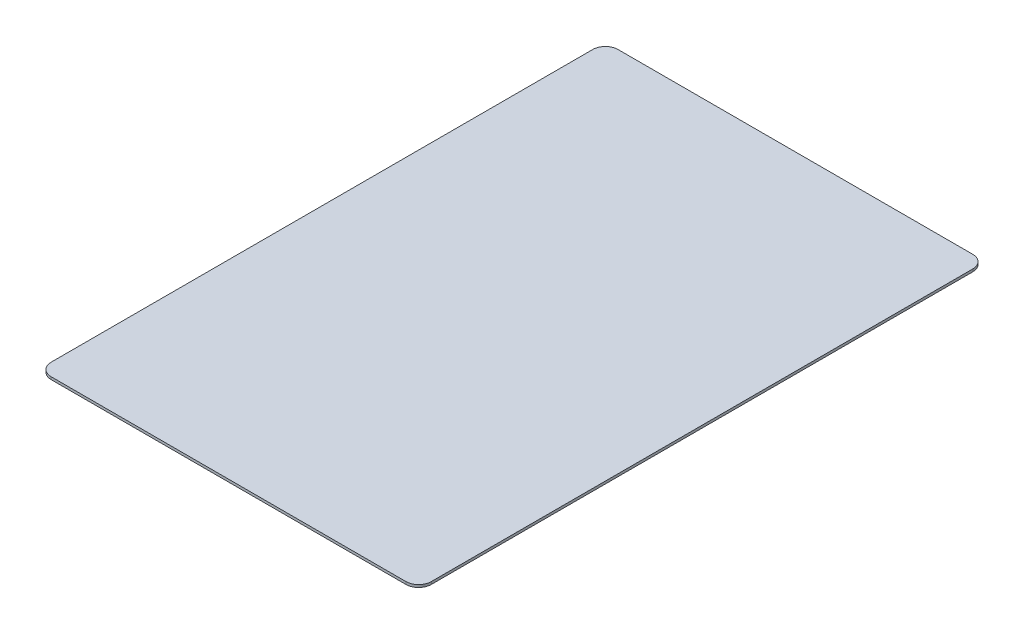
ISO-10303-21;
HEADER;
FILE_DESCRIPTION(('STEP AP214'),'2;1');
FILE_NAME('part.step','',(''),(''),'','','');
FILE_SCHEMA(('AUTOMOTIVE_DESIGN { 1 0 10303 214 1 1 1 1 }'));
ENDSEC;
DATA;
#1=APPLICATION_CONTEXT('core data for automotive mechanical design processes');
#2=APPLICATION_PROTOCOL_DEFINITION('international standard','automotive_design',2000,#1);
#3=PRODUCT_CONTEXT('',#1,'mechanical');
#4=PRODUCT('Part','Part','',(#3));
#5=PRODUCT_RELATED_PRODUCT_CATEGORY('part','',(#4));
#6=PRODUCT_DEFINITION_FORMATION('','',#4);
#7=PRODUCT_DEFINITION_CONTEXT('part definition',#1,'design');
#8=PRODUCT_DEFINITION('design','',#6,#7);
#9=PRODUCT_DEFINITION_SHAPE('','',#8);
#10=(LENGTH_UNIT() NAMED_UNIT(*) SI_UNIT(.MILLI.,.METRE.));
#11=(NAMED_UNIT(*) PLANE_ANGLE_UNIT() SI_UNIT($,.RADIAN.));
#12=(NAMED_UNIT(*) SI_UNIT($,.STERADIAN.) SOLID_ANGLE_UNIT());
#13=UNCERTAINTY_MEASURE_WITH_UNIT(LENGTH_MEASURE(1.E-05),#10,'distance_accuracy_value','');
#14=(GEOMETRIC_REPRESENTATION_CONTEXT(3) GLOBAL_UNCERTAINTY_ASSIGNED_CONTEXT((#13)) GLOBAL_UNIT_ASSIGNED_CONTEXT((#10,
#11,#12)) REPRESENTATION_CONTEXT('',''));
#15=CARTESIAN_POINT('',(0.,0.,0.));
#16=DIRECTION('',(0.,0.,1.));
#17=DIRECTION('',(1.,0.,0.));
#18=AXIS2_PLACEMENT_3D('',#15,#16,#17);
#19=CARTESIAN_POINT('',(191.404976339605,-438.40497633594,-287.054793447494));
#20=DIRECTION('',(-1.,0.,0.));
#21=DIRECTION('',(0.,-1.,0.));
#22=AXIS2_PLACEMENT_3D('',#19,#20,#21);
#23=PLANE('',#22);
#24=DIRECTION('',(0.,0.,-1.));
#25=VECTOR('',#24,1.);
#26=CARTESIAN_POINT('',(191.404976339605,-438.40497633594,-287.054793447494));
#27=LINE('',#26,#25);
#28=CARTESIAN_POINT('',(191.404976339605,-438.40497633594,-297.054793447494));
#29=VERTEX_POINT('',#28);
#30=CARTESIAN_POINT('',(191.404976339605,-438.40497633594,-724.46768735451));
#31=VERTEX_POINT('',#30);
#32=EDGE_CURVE('E128',#29,#31,#27,.T.);
#33=ORIENTED_EDGE('',*,*,#32,.T.);
#34=DIRECTION('',(0.,-1.,0.));
#35=VECTOR('',#34,1.);
#36=CARTESIAN_POINT('',(191.404976339605,-438.40497633594,-724.46768735451));
#37=LINE('',#36,#35);
#38=CARTESIAN_POINT('',(191.404976339605,-440.40497633594,-724.46768735451));
#39=VERTEX_POINT('',#38);
#40=EDGE_CURVE('E11',#31,#39,#37,.T.);
#41=ORIENTED_EDGE('',*,*,#40,.T.);
#42=DIRECTION('',(0.,0.,-1.));
#43=VECTOR('',#42,1.);
#44=CARTESIAN_POINT('',(191.404976339605,-440.40497633594,-287.054793447494));
#45=LINE('',#44,#43);
#46=CARTESIAN_POINT('',(191.404976339605,-440.40497633594,-297.054793447494));
#47=VERTEX_POINT('',#46);
#48=EDGE_CURVE('E130',#47,#39,#45,.T.);
#49=ORIENTED_EDGE('',*,*,#48,.F.);
#50=DIRECTION('',(0.,-1.,0.));
#51=VECTOR('',#50,1.);
#52=CARTESIAN_POINT('',(191.404976339605,-438.40497633594,-297.054793447494));
#53=LINE('',#52,#51);
#54=EDGE_CURVE('E41',#47,#29,#53,.F.);
#55=ORIENTED_EDGE('',*,*,#54,.T.);
#56=EDGE_LOOP('',(#33,#41,#49,#55));
#57=FACE_BOUND('',#56,.T.);
#58=ADVANCED_FACE('F33',(#57),#23,.T.);
#59=CARTESIAN_POINT('',(191.404976339605,-438.40497633594,-287.054793447494));
#60=DIRECTION('',(0.,0.,-1.));
#61=DIRECTION('',(0.,1.,0.));
#62=AXIS2_PLACEMENT_3D('',#59,#60,#61);
#63=PLANE('',#62);
#64=DIRECTION('',(1.,0.,0.));
#65=VECTOR('',#64,1.);
#66=CARTESIAN_POINT('',(191.404976339605,-440.40497633594,-287.054793447494));
#67=LINE('',#66,#65);
#68=CARTESIAN_POINT('',(201.404976339605,-440.40497633594,-287.054793447494));
#69=VERTEX_POINT('',#68);
#70=CARTESIAN_POINT('',(481.404976339607,-440.40497633594,-287.054793447494));
#71=VERTEX_POINT('',#70);
#72=EDGE_CURVE('E125',#69,#71,#67,.T.);
#73=ORIENTED_EDGE('',*,*,#72,.T.);
#74=DIRECTION('',(0.,-1.,0.));
#75=VECTOR('',#74,1.);
#76=CARTESIAN_POINT('',(481.404976339607,-438.40497633594,-287.054793447494));
#77=LINE('',#76,#75);
#78=CARTESIAN_POINT('',(481.404976339607,-438.40497633594,-287.054793447494));
#79=VERTEX_POINT('',#78);
#80=EDGE_CURVE('E105',#71,#79,#77,.F.);
#81=ORIENTED_EDGE('',*,*,#80,.T.);
#82=DIRECTION('',(1.,0.,0.));
#83=VECTOR('',#82,1.);
#84=CARTESIAN_POINT('',(191.404976339605,-438.40497633594,-287.054793447494));
#85=LINE('',#84,#83);
#86=CARTESIAN_POINT('',(201.404976339605,-438.40497633594,-287.054793447494));
#87=VERTEX_POINT('',#86);
#88=EDGE_CURVE('E134',#87,#79,#85,.T.);
#89=ORIENTED_EDGE('',*,*,#88,.F.);
#90=DIRECTION('',(0.,-1.,0.));
#91=VECTOR('',#90,1.);
#92=CARTESIAN_POINT('',(201.404976339605,-440.40497633594,-287.054793447494));
#93=LINE('',#92,#91);
#94=EDGE_CURVE('E110',#87,#69,#93,.T.);
#95=ORIENTED_EDGE('',*,*,#94,.T.);
#96=EDGE_LOOP('',(#73,#81,#89,#95));
#97=FACE_BOUND('',#96,.T.);
#98=ADVANCED_FACE('F170',(#97),#63,.F.);
#99=CARTESIAN_POINT('',(491.404976339607,-438.40497633594,-287.054793447494));
#100=DIRECTION('',(-1.,0.,0.));
#101=DIRECTION('',(0.,-1.,0.));
#102=AXIS2_PLACEMENT_3D('',#99,#100,#101);
#103=PLANE('',#102);
#104=DIRECTION('',(0.,0.,-1.));
#105=VECTOR('',#104,1.);
#106=CARTESIAN_POINT('',(491.404976339607,-438.40497633594,-287.054793447494));
#107=LINE('',#106,#105);
#108=CARTESIAN_POINT('',(491.404976339607,-438.40497633594,-297.054793447494));
#109=VERTEX_POINT('',#108);
#110=CARTESIAN_POINT('',(491.404976339607,-438.40497633594,-724.46768735451));
#111=VERTEX_POINT('',#110);
#112=EDGE_CURVE('E119',#109,#111,#107,.T.);
#113=ORIENTED_EDGE('',*,*,#112,.F.);
#114=DIRECTION('',(0.,-1.,0.));
#115=VECTOR('',#114,1.);
#116=CARTESIAN_POINT('',(491.404976339607,-438.40497633594,-297.054793447494));
#117=LINE('',#116,#115);
#118=CARTESIAN_POINT('',(491.404976339607,-440.40497633594,-297.054793447494));
#119=VERTEX_POINT('',#118);
#120=EDGE_CURVE('E104',#109,#119,#117,.T.);
#121=ORIENTED_EDGE('',*,*,#120,.T.);
#122=DIRECTION('',(0.,0.,-1.));
#123=VECTOR('',#122,1.);
#124=CARTESIAN_POINT('',(491.404976339607,-440.40497633594,-287.054793447494));
#125=LINE('',#124,#123);
#126=CARTESIAN_POINT('',(491.404976339607,-440.40497633594,-724.46768735451));
#127=VERTEX_POINT('',#126);
#128=EDGE_CURVE('E117',#119,#127,#125,.T.);
#129=ORIENTED_EDGE('',*,*,#128,.T.);
#130=DIRECTION('',(0.,-1.,0.));
#131=VECTOR('',#130,1.);
#132=CARTESIAN_POINT('',(491.404976339607,-438.40497633594,-724.46768735451));
#133=LINE('',#132,#131);
#134=EDGE_CURVE('E121',#127,#111,#133,.F.);
#135=ORIENTED_EDGE('',*,*,#134,.T.);
#136=EDGE_LOOP('',(#113,#121,#129,#135));
#137=FACE_BOUND('',#136,.T.);
#138=ADVANCED_FACE('F116',(#137),#103,.F.);
#139=CARTESIAN_POINT('',(191.404976339605,-438.40497633594,-734.46768735451));
#140=DIRECTION('',(0.,0.,-1.));
#141=DIRECTION('',(0.,1.,0.));
#142=AXIS2_PLACEMENT_3D('',#139,#140,#141);
#143=PLANE('',#142);
#144=DIRECTION('',(1.,0.,0.));
#145=VECTOR('',#144,1.);
#146=CARTESIAN_POINT('',(191.404976339605,-438.40497633594,-734.46768735451));
#147=LINE('',#146,#145);
#148=CARTESIAN_POINT('',(201.404976339605,-438.40497633594,-734.46768735451));
#149=VERTEX_POINT('',#148);
#150=CARTESIAN_POINT('',(481.404976339607,-438.40497633594,-734.46768735451));
#151=VERTEX_POINT('',#150);
#152=EDGE_CURVE('E166',#149,#151,#147,.T.);
#153=ORIENTED_EDGE('',*,*,#152,.T.);
#154=DIRECTION('',(0.,-1.,0.));
#155=VECTOR('',#154,1.);
#156=CARTESIAN_POINT('',(481.404976339607,-440.40497633594,-734.46768735451));
#157=LINE('',#156,#155);
#158=CARTESIAN_POINT('',(481.404976339607,-440.40497633594,-734.46768735451));
#159=VERTEX_POINT('',#158);
#160=EDGE_CURVE('E151',#151,#159,#157,.T.);
#161=ORIENTED_EDGE('',*,*,#160,.T.);
#162=DIRECTION('',(1.,0.,0.));
#163=VECTOR('',#162,1.);
#164=CARTESIAN_POINT('',(191.404976339605,-440.40497633594,-734.46768735451));
#165=LINE('',#164,#163);
#166=CARTESIAN_POINT('',(201.404976339605,-440.40497633594,-734.46768735451));
#167=VERTEX_POINT('',#166);
#168=EDGE_CURVE('E126',#167,#159,#165,.T.);
#169=ORIENTED_EDGE('',*,*,#168,.F.);
#170=DIRECTION('',(0.,-1.,0.));
#171=VECTOR('',#170,1.);
#172=CARTESIAN_POINT('',(201.404976339605,-438.40497633594,-734.46768735451));
#173=LINE('',#172,#171);
#174=EDGE_CURVE('E55',#167,#149,#173,.F.);
#175=ORIENTED_EDGE('',*,*,#174,.T.);
#176=EDGE_LOOP('',(#153,#161,#169,#175));
#177=FACE_BOUND('',#176,.T.);
#178=ADVANCED_FACE('F175',(#177),#143,.T.);
#179=CARTESIAN_POINT('',(0.,-438.40497633594,0.));
#180=DIRECTION('',(0.,-1.,0.));
#181=DIRECTION('',(1.,0.,0.));
#182=AXIS2_PLACEMENT_3D('',#179,#180,#181);
#183=PLANE('',#182);
#184=ORIENTED_EDGE('',*,*,#88,.T.);
#185=CARTESIAN_POINT('',(481.404976339607,-438.40497633594,-297.054793447494));
#186=DIRECTION('',(0.,-1.,0.));
#187=DIRECTION('',(1.,0.,0.));
#188=AXIS2_PLACEMENT_3D('',#185,#186,#187);
#189=CIRCLE('',#188,10.);
#190=EDGE_CURVE('E148',#79,#109,#189,.F.);
#191=ORIENTED_EDGE('',*,*,#190,.T.);
#192=ORIENTED_EDGE('',*,*,#112,.T.);
#193=CARTESIAN_POINT('',(481.404976339607,-438.40497633594,-724.46768735451));
#194=DIRECTION('',(0.,-1.,0.));
#195=DIRECTION('',(1.,0.,0.));
#196=AXIS2_PLACEMENT_3D('',#193,#194,#195);
#197=CIRCLE('',#196,10.);
#198=EDGE_CURVE('E48',#111,#151,#197,.F.);
#199=ORIENTED_EDGE('',*,*,#198,.T.);
#200=ORIENTED_EDGE('',*,*,#152,.F.);
#201=CARTESIAN_POINT('',(201.404976339605,-438.40497633594,-724.46768735451));
#202=DIRECTION('',(0.,-1.,0.));
#203=DIRECTION('',(1.,0.,0.));
#204=AXIS2_PLACEMENT_3D('',#201,#202,#203);
#205=CIRCLE('',#204,10.);
#206=EDGE_CURVE('E145',#149,#31,#205,.F.);
#207=ORIENTED_EDGE('',*,*,#206,.T.);
#208=ORIENTED_EDGE('',*,*,#32,.F.);
#209=CARTESIAN_POINT('',(201.404976339605,-438.40497633594,-297.054793447494));
#210=DIRECTION('',(0.,-1.,0.));
#211=DIRECTION('',(1.,0.,0.));
#212=AXIS2_PLACEMENT_3D('',#209,#210,#211);
#213=CIRCLE('',#212,10.);
#214=EDGE_CURVE('E143',#29,#87,#213,.F.);
#215=ORIENTED_EDGE('',*,*,#214,.T.);
#216=EDGE_LOOP('',(#184,#191,#192,#199,#200,#207,#208,#215));
#217=FACE_BOUND('',#216,.T.);
#218=ADVANCED_FACE('F163',(#217),#183,.F.);
#219=CARTESIAN_POINT('',(0.,-440.40497633594,0.));
#220=DIRECTION('',(0.,-1.,0.));
#221=DIRECTION('',(1.,0.,0.));
#222=AXIS2_PLACEMENT_3D('',#219,#220,#221);
#223=PLANE('',#222);
#224=ORIENTED_EDGE('',*,*,#128,.F.);
#225=CARTESIAN_POINT('',(481.404976339607,-440.40497633594,-297.054793447494));
#226=DIRECTION('',(0.,-1.,0.));
#227=DIRECTION('',(1.,0.,0.));
#228=AXIS2_PLACEMENT_3D('',#225,#226,#227);
#229=CIRCLE('',#228,10.);
#230=EDGE_CURVE('E100',#119,#71,#229,.T.);
#231=ORIENTED_EDGE('',*,*,#230,.T.);
#232=ORIENTED_EDGE('',*,*,#72,.F.);
#233=CARTESIAN_POINT('',(201.404976339605,-440.40497633594,-297.054793447494));
#234=DIRECTION('',(0.,-1.,0.));
#235=DIRECTION('',(1.,0.,0.));
#236=AXIS2_PLACEMENT_3D('',#233,#234,#235);
#237=CIRCLE('',#236,10.);
#238=EDGE_CURVE('E120',#69,#47,#237,.T.);
#239=ORIENTED_EDGE('',*,*,#238,.T.);
#240=ORIENTED_EDGE('',*,*,#48,.T.);
#241=CARTESIAN_POINT('',(201.404976339605,-440.40497633594,-724.46768735451));
#242=DIRECTION('',(0.,-1.,0.));
#243=DIRECTION('',(1.,0.,0.));
#244=AXIS2_PLACEMENT_3D('',#241,#242,#243);
#245=CIRCLE('',#244,10.);
#246=EDGE_CURVE('E137',#39,#167,#245,.T.);
#247=ORIENTED_EDGE('',*,*,#246,.T.);
#248=ORIENTED_EDGE('',*,*,#168,.T.);
#249=CARTESIAN_POINT('',(481.404976339607,-440.40497633594,-724.46768735451));
#250=DIRECTION('',(0.,-1.,0.));
#251=DIRECTION('',(1.,0.,0.));
#252=AXIS2_PLACEMENT_3D('',#249,#250,#251);
#253=CIRCLE('',#252,10.);
#254=EDGE_CURVE('E111',#159,#127,#253,.T.);
#255=ORIENTED_EDGE('',*,*,#254,.T.);
#256=EDGE_LOOP('',(#224,#231,#232,#239,#240,#247,#248,#255));
#257=FACE_BOUND('',#256,.T.);
#258=ADVANCED_FACE('F123',(#257),#223,.T.);
#259=CARTESIAN_POINT('',(481.404976339607,-438.40497633594,-297.054793447494));
#260=DIRECTION('',(0.,-1.,0.));
#261=DIRECTION('',(1.,0.,0.));
#262=AXIS2_PLACEMENT_3D('',#259,#260,#261);
#263=CYLINDRICAL_SURFACE('',#262,10.);
#264=ORIENTED_EDGE('',*,*,#190,.F.);
#265=ORIENTED_EDGE('',*,*,#80,.F.);
#266=ORIENTED_EDGE('',*,*,#230,.F.);
#267=ORIENTED_EDGE('',*,*,#120,.F.);
#268=EDGE_LOOP('',(#264,#265,#266,#267));
#269=FACE_BOUND('',#268,.T.);
#270=ADVANCED_FACE('F103',(#269),#263,.T.);
#271=CARTESIAN_POINT('',(481.404976339607,-438.40497633594,-724.46768735451));
#272=DIRECTION('',(0.,1.,0.));
#273=DIRECTION('',(-1.,0.,0.));
#274=AXIS2_PLACEMENT_3D('',#271,#272,#273);
#275=CYLINDRICAL_SURFACE('',#274,10.);
#276=ORIENTED_EDGE('',*,*,#198,.F.);
#277=ORIENTED_EDGE('',*,*,#134,.F.);
#278=ORIENTED_EDGE('',*,*,#254,.F.);
#279=ORIENTED_EDGE('',*,*,#160,.F.);
#280=EDGE_LOOP('',(#276,#277,#278,#279));
#281=FACE_BOUND('',#280,.T.);
#282=ADVANCED_FACE('F177',(#281),#275,.T.);
#283=CARTESIAN_POINT('',(201.404976339605,-438.40497633594,-724.46768735451));
#284=DIRECTION('',(0.,-1.,0.));
#285=DIRECTION('',(1.,0.,0.));
#286=AXIS2_PLACEMENT_3D('',#283,#284,#285);
#287=CYLINDRICAL_SURFACE('',#286,10.);
#288=ORIENTED_EDGE('',*,*,#206,.F.);
#289=ORIENTED_EDGE('',*,*,#174,.F.);
#290=ORIENTED_EDGE('',*,*,#246,.F.);
#291=ORIENTED_EDGE('',*,*,#40,.F.);
#292=EDGE_LOOP('',(#288,#289,#290,#291));
#293=FACE_BOUND('',#292,.T.);
#294=ADVANCED_FACE('F179',(#293),#287,.T.);
#295=CARTESIAN_POINT('',(201.404976339605,-438.40497633594,-297.054793447494));
#296=DIRECTION('',(0.,1.,0.));
#297=DIRECTION('',(-1.,0.,0.));
#298=AXIS2_PLACEMENT_3D('',#295,#296,#297);
#299=CYLINDRICAL_SURFACE('',#298,10.);
#300=ORIENTED_EDGE('',*,*,#214,.F.);
#301=ORIENTED_EDGE('',*,*,#54,.F.);
#302=ORIENTED_EDGE('',*,*,#238,.F.);
#303=ORIENTED_EDGE('',*,*,#94,.F.);
#304=EDGE_LOOP('',(#300,#301,#302,#303));
#305=FACE_BOUND('',#304,.T.);
#306=ADVANCED_FACE('F35',(#305),#299,.T.);
#307=CLOSED_SHELL('',(#58,#98,#138,#178,#218,#258,#270,#282,#294,#306));
#308=MANIFOLD_SOLID_BREP('B2',#307);
#309=ADVANCED_BREP_SHAPE_REPRESENTATION('',(#18,#308),#14);
#310=SHAPE_DEFINITION_REPRESENTATION(#9,#309);
ENDSEC;
END-ISO-10303-21;
